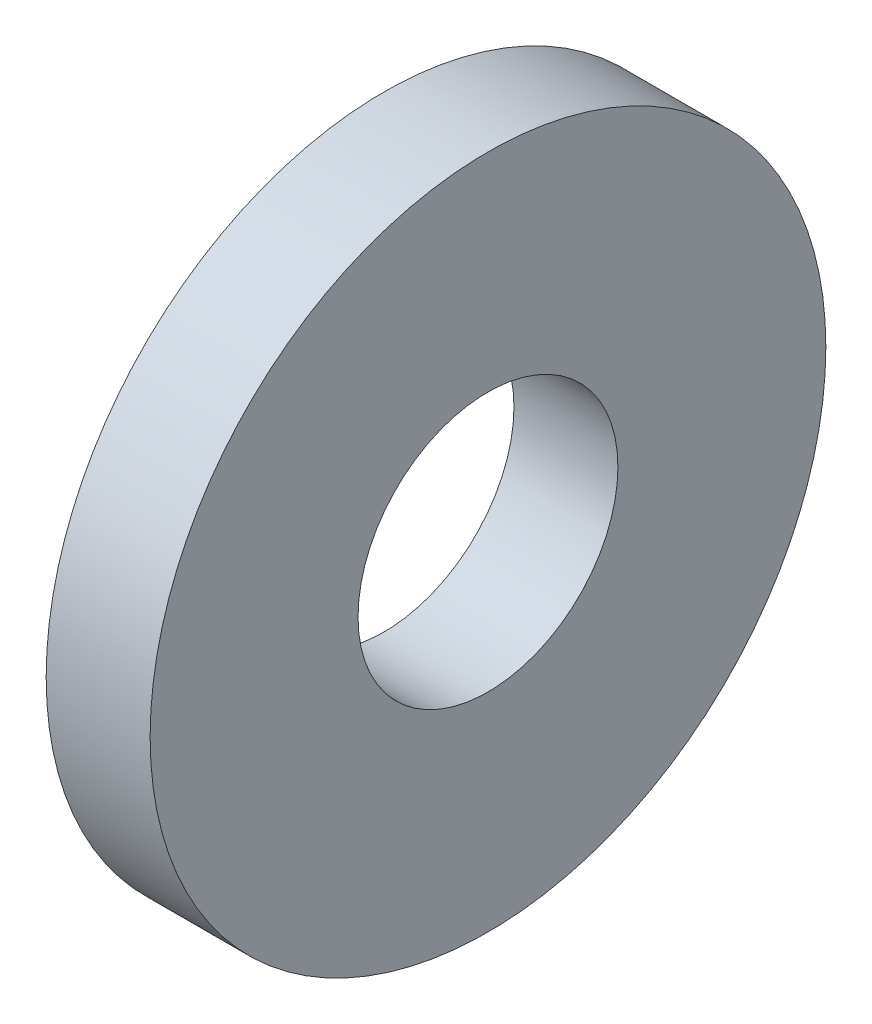
ISO-10303-21;
HEADER;
FILE_DESCRIPTION(('STEP AP214'),'2;1');
FILE_NAME('part.step','',(''),(''),'','','');
FILE_SCHEMA(('AUTOMOTIVE_DESIGN { 1 0 10303 214 1 1 1 1 }'));
ENDSEC;
DATA;
#1=APPLICATION_CONTEXT('core data for automotive mechanical design processes');
#2=APPLICATION_PROTOCOL_DEFINITION('international standard','automotive_design',2000,#1);
#3=PRODUCT_CONTEXT('',#1,'mechanical');
#4=PRODUCT('Part','Part','',(#3));
#5=PRODUCT_RELATED_PRODUCT_CATEGORY('part','',(#4));
#6=PRODUCT_DEFINITION_FORMATION('','',#4);
#7=PRODUCT_DEFINITION_CONTEXT('part definition',#1,'design');
#8=PRODUCT_DEFINITION('design','',#6,#7);
#9=PRODUCT_DEFINITION_SHAPE('','',#8);
#10=(LENGTH_UNIT() NAMED_UNIT(*) SI_UNIT(.MILLI.,.METRE.));
#11=(NAMED_UNIT(*) PLANE_ANGLE_UNIT() SI_UNIT($,.RADIAN.));
#12=(NAMED_UNIT(*) SI_UNIT($,.STERADIAN.) SOLID_ANGLE_UNIT());
#13=UNCERTAINTY_MEASURE_WITH_UNIT(LENGTH_MEASURE(1.E-05),#10,'distance_accuracy_value','');
#14=(GEOMETRIC_REPRESENTATION_CONTEXT(3) GLOBAL_UNCERTAINTY_ASSIGNED_CONTEXT((#13)) GLOBAL_UNIT_ASSIGNED_CONTEXT((#10,
#11,#12)) REPRESENTATION_CONTEXT('',''));
#15=CARTESIAN_POINT('',(0.,0.,0.));
#16=DIRECTION('',(0.,0.,1.));
#17=DIRECTION('',(1.,0.,0.));
#18=AXIS2_PLACEMENT_3D('',#15,#16,#17);
#19=CARTESIAN_POINT('',(-1.,2.50000000000003,0.));
#20=DIRECTION('',(-1.,0.,0.));
#21=DIRECTION('',(0.,0.,1.));
#22=AXIS2_PLACEMENT_3D('',#19,#20,#21);
#23=PLANE('',#22);
#24=CARTESIAN_POINT('',(-1.,0.,0.));
#25=DIRECTION('',(-1.,0.,0.));
#26=DIRECTION('',(0.,0.,1.));
#27=AXIS2_PLACEMENT_3D('',#24,#25,#26);
#28=CIRCLE('',#27,6.5);
#29=CARTESIAN_POINT('',(-1.,0.,6.50000000000003));
#30=VERTEX_POINT('',#29);
#31=EDGE_CURVE('E10',#30,#30,#28,.T.);
#32=ORIENTED_EDGE('',*,*,#31,.T.);
#33=EDGE_LOOP('',(#32));
#34=FACE_BOUND('',#33,.T.);
#35=CARTESIAN_POINT('',(-1.,0.,0.));
#36=DIRECTION('',(-1.,0.,0.));
#37=DIRECTION('',(0.,0.,1.));
#38=AXIS2_PLACEMENT_3D('',#35,#36,#37);
#39=CIRCLE('',#38,2.5);
#40=CARTESIAN_POINT('',(-1.,0.,2.50000000000001));
#41=VERTEX_POINT('',#40);
#42=EDGE_CURVE('E54',#41,#41,#39,.T.);
#43=ORIENTED_EDGE('',*,*,#42,.F.);
#44=EDGE_LOOP('',(#43));
#45=FACE_BOUND('',#44,.T.);
#46=ADVANCED_FACE('F36',(#34,#45),#23,.T.);
#47=CARTESIAN_POINT('',(1.,0.,0.));
#48=DIRECTION('',(-1.,0.,0.));
#49=DIRECTION('',(0.,0.,1.));
#50=AXIS2_PLACEMENT_3D('',#47,#48,#49);
#51=CYLINDRICAL_SURFACE('',#50,6.5);
#52=CARTESIAN_POINT('',(1.,0.,0.));
#53=DIRECTION('',(-1.,0.,0.));
#54=DIRECTION('',(0.,0.,1.));
#55=AXIS2_PLACEMENT_3D('',#52,#53,#54);
#56=CIRCLE('',#55,6.5);
#57=CARTESIAN_POINT('',(1.,0.,6.50000000000003));
#58=VERTEX_POINT('',#57);
#59=EDGE_CURVE('E43',#58,#58,#56,.T.);
#60=ORIENTED_EDGE('',*,*,#59,.T.);
#61=EDGE_LOOP('',(#60));
#62=FACE_BOUND('',#61,.T.);
#63=ORIENTED_EDGE('',*,*,#31,.F.);
#64=EDGE_LOOP('',(#63));
#65=FACE_BOUND('',#64,.T.);
#66=ADVANCED_FACE('F64',(#62,#65),#51,.T.);
#67=CARTESIAN_POINT('',(1.,6.50000000000006,0.));
#68=DIRECTION('',(1.,0.,0.));
#69=DIRECTION('',(0.,0.,-1.));
#70=AXIS2_PLACEMENT_3D('',#67,#68,#69);
#71=PLANE('',#70);
#72=CARTESIAN_POINT('',(1.,0.,0.));
#73=DIRECTION('',(-1.,0.,0.));
#74=DIRECTION('',(0.,0.,1.));
#75=AXIS2_PLACEMENT_3D('',#72,#73,#74);
#76=CIRCLE('',#75,2.5);
#77=CARTESIAN_POINT('',(1.,0.,2.50000000000001));
#78=VERTEX_POINT('',#77);
#79=EDGE_CURVE('E49',#78,#78,#76,.T.);
#80=ORIENTED_EDGE('',*,*,#79,.T.);
#81=EDGE_LOOP('',(#80));
#82=FACE_BOUND('',#81,.T.);
#83=ORIENTED_EDGE('',*,*,#59,.F.);
#84=EDGE_LOOP('',(#83));
#85=FACE_BOUND('',#84,.T.);
#86=ADVANCED_FACE('F68',(#82,#85),#71,.T.);
#87=CARTESIAN_POINT('',(1.,0.,0.));
#88=DIRECTION('',(-1.,0.,0.));
#89=DIRECTION('',(0.,0.,1.));
#90=AXIS2_PLACEMENT_3D('',#87,#88,#89);
#91=CYLINDRICAL_SURFACE('',#90,2.5);
#92=ORIENTED_EDGE('',*,*,#42,.T.);
#93=EDGE_LOOP('',(#92));
#94=FACE_BOUND('',#93,.T.);
#95=ORIENTED_EDGE('',*,*,#79,.F.);
#96=EDGE_LOOP('',(#95));
#97=FACE_BOUND('',#96,.T.);
#98=ADVANCED_FACE('F60',(#94,#97),#91,.F.);
#99=CLOSED_SHELL('',(#46,#66,#86,#98));
#100=MANIFOLD_SOLID_BREP('B2',#99);
#101=ADVANCED_BREP_SHAPE_REPRESENTATION('',(#18,#100),#14);
#102=SHAPE_DEFINITION_REPRESENTATION(#9,#101);
ENDSEC;
END-ISO-10303-21;
